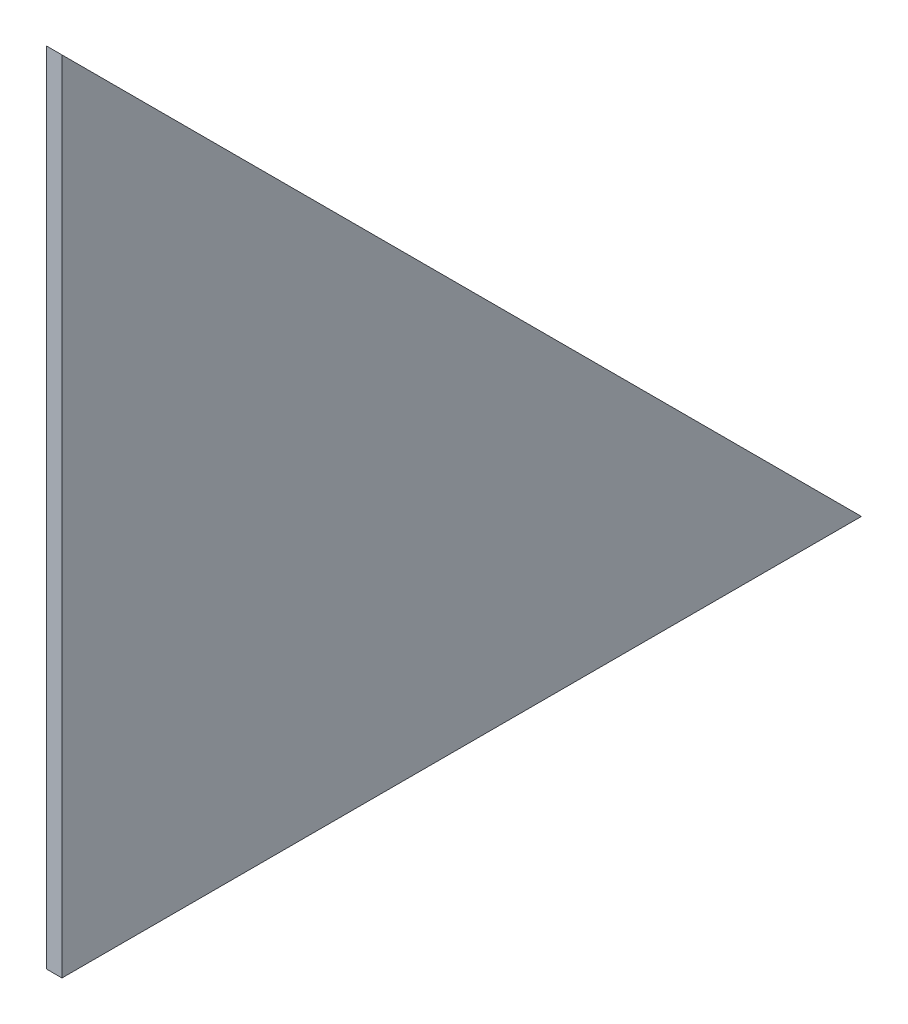
ISO-10303-21;
HEADER;
FILE_DESCRIPTION(('STEP AP214'),'2;1');
FILE_NAME('part.step','',(''),(''),'','','');
FILE_SCHEMA(('AUTOMOTIVE_DESIGN { 1 0 10303 214 1 1 1 1 }'));
ENDSEC;
DATA;
#1=APPLICATION_CONTEXT('core data for automotive mechanical design processes');
#2=APPLICATION_PROTOCOL_DEFINITION('international standard','automotive_design',2000,#1);
#3=PRODUCT_CONTEXT('',#1,'mechanical');
#4=PRODUCT('Part','Part','',(#3));
#5=PRODUCT_RELATED_PRODUCT_CATEGORY('part','',(#4));
#6=PRODUCT_DEFINITION_FORMATION('','',#4);
#7=PRODUCT_DEFINITION_CONTEXT('part definition',#1,'design');
#8=PRODUCT_DEFINITION('design','',#6,#7);
#9=PRODUCT_DEFINITION_SHAPE('','',#8);
#10=(LENGTH_UNIT() NAMED_UNIT(*) SI_UNIT(.MILLI.,.METRE.));
#11=(NAMED_UNIT(*) PLANE_ANGLE_UNIT() SI_UNIT($,.RADIAN.));
#12=(NAMED_UNIT(*) SI_UNIT($,.STERADIAN.) SOLID_ANGLE_UNIT());
#13=UNCERTAINTY_MEASURE_WITH_UNIT(LENGTH_MEASURE(1.E-05),#10,'distance_accuracy_value','');
#14=(GEOMETRIC_REPRESENTATION_CONTEXT(3) GLOBAL_UNCERTAINTY_ASSIGNED_CONTEXT((#13)) GLOBAL_UNIT_ASSIGNED_CONTEXT((#10,
#11,#12)) REPRESENTATION_CONTEXT('',''));
#15=CARTESIAN_POINT('',(0.,0.,0.));
#16=DIRECTION('',(0.,0.,1.));
#17=DIRECTION('',(1.,0.,0.));
#18=AXIS2_PLACEMENT_3D('',#15,#16,#17);
#19=CARTESIAN_POINT('',(3.175,0.,-165.099999999999));
#20=DIRECTION('',(0.,1.,0.));
#21=DIRECTION('',(0.,0.,1.));
#22=AXIS2_PLACEMENT_3D('',#19,#20,#21);
#23=PLANE('',#22);
#24=DIRECTION('',(0.,0.,-1.));
#25=VECTOR('',#24,1.);
#26=CARTESIAN_POINT('',(0.,0.,-165.099999999999));
#27=LINE('',#26,#25);
#28=CARTESIAN_POINT('',(0.,0.,0.));
#29=VERTEX_POINT('',#28);
#30=CARTESIAN_POINT('',(0.,0.,-165.099999999999));
#31=VERTEX_POINT('',#30);
#32=EDGE_CURVE('E89',#29,#31,#27,.T.);
#33=ORIENTED_EDGE('',*,*,#32,.T.);
#34=DIRECTION('',(-1.,0.,0.));
#35=VECTOR('',#34,1.);
#36=CARTESIAN_POINT('',(3.175,0.,-165.099999999999));
#37=LINE('',#36,#35);
#38=CARTESIAN_POINT('',(3.175,0.,-165.099999999999));
#39=VERTEX_POINT('',#38);
#40=EDGE_CURVE('E11',#39,#31,#37,.T.);
#41=ORIENTED_EDGE('',*,*,#40,.F.);
#42=DIRECTION('',(0.,0.,-1.));
#43=VECTOR('',#42,1.);
#44=CARTESIAN_POINT('',(3.175,0.,-165.099999999999));
#45=LINE('',#44,#43);
#46=CARTESIAN_POINT('',(3.175,0.,0.));
#47=VERTEX_POINT('',#46);
#48=EDGE_CURVE('E81',#47,#39,#45,.T.);
#49=ORIENTED_EDGE('',*,*,#48,.F.);
#50=DIRECTION('',(-1.,0.,0.));
#51=VECTOR('',#50,1.);
#52=CARTESIAN_POINT('',(3.175,0.,0.));
#53=LINE('',#52,#51);
#54=EDGE_CURVE('E90',#47,#29,#53,.T.);
#55=ORIENTED_EDGE('',*,*,#54,.T.);
#56=EDGE_LOOP('',(#33,#41,#49,#55));
#57=FACE_BOUND('',#56,.T.);
#58=ADVANCED_FACE('F39',(#57),#23,.F.);
#59=CARTESIAN_POINT('',(3.175,165.100000000001,0.));
#60=DIRECTION('',(0.,-0.707106781186544,0.707106781186551));
#61=DIRECTION('',(0.,-0.707106781186551,-0.707106781186544));
#62=AXIS2_PLACEMENT_3D('',#59,#60,#61);
#63=PLANE('',#62);
#64=DIRECTION('',(0.,0.707106781186551,0.707106781186544));
#65=VECTOR('',#64,1.);
#66=CARTESIAN_POINT('',(0.,165.100000000001,0.));
#67=LINE('',#66,#65);
#68=CARTESIAN_POINT('',(0.,165.100000000001,0.));
#69=VERTEX_POINT('',#68);
#70=EDGE_CURVE('E68',#31,#69,#67,.T.);
#71=ORIENTED_EDGE('',*,*,#70,.T.);
#72=DIRECTION('',(-1.,0.,0.));
#73=VECTOR('',#72,1.);
#74=CARTESIAN_POINT('',(3.175,165.100000000001,0.));
#75=LINE('',#74,#73);
#76=CARTESIAN_POINT('',(3.175,165.100000000001,0.));
#77=VERTEX_POINT('',#76);
#78=EDGE_CURVE('E48',#77,#69,#75,.T.);
#79=ORIENTED_EDGE('',*,*,#78,.F.);
#80=DIRECTION('',(0.,0.707106781186551,0.707106781186544));
#81=VECTOR('',#80,1.);
#82=CARTESIAN_POINT('',(3.175,165.100000000001,0.));
#83=LINE('',#82,#81);
#84=EDGE_CURVE('E76',#39,#77,#83,.T.);
#85=ORIENTED_EDGE('',*,*,#84,.F.);
#86=ORIENTED_EDGE('',*,*,#40,.T.);
#87=EDGE_LOOP('',(#71,#79,#85,#86));
#88=FACE_BOUND('',#87,.T.);
#89=ADVANCED_FACE('F77',(#88),#63,.F.);
#90=CARTESIAN_POINT('',(3.175,0.,0.));
#91=DIRECTION('',(0.,0.,-1.));
#92=DIRECTION('',(-1.,0.,0.));
#93=AXIS2_PLACEMENT_3D('',#90,#91,#92);
#94=PLANE('',#93);
#95=DIRECTION('',(0.,-1.,0.));
#96=VECTOR('',#95,1.);
#97=CARTESIAN_POINT('',(0.,0.,0.));
#98=LINE('',#97,#96);
#99=EDGE_CURVE('E73',#69,#29,#98,.T.);
#100=ORIENTED_EDGE('',*,*,#99,.T.);
#101=ORIENTED_EDGE('',*,*,#54,.F.);
#102=DIRECTION('',(0.,-1.,0.));
#103=VECTOR('',#102,1.);
#104=CARTESIAN_POINT('',(3.175,0.,0.));
#105=LINE('',#104,#103);
#106=EDGE_CURVE('E56',#77,#47,#105,.T.);
#107=ORIENTED_EDGE('',*,*,#106,.F.);
#108=ORIENTED_EDGE('',*,*,#78,.T.);
#109=EDGE_LOOP('',(#100,#101,#107,#108));
#110=FACE_BOUND('',#109,.T.);
#111=ADVANCED_FACE('F102',(#110),#94,.F.);
#112=CARTESIAN_POINT('',(3.175,0.,0.));
#113=DIRECTION('',(-1.,0.,0.));
#114=DIRECTION('',(0.,0.,1.));
#115=AXIS2_PLACEMENT_3D('',#112,#113,#114);
#116=PLANE('',#115);
#117=ORIENTED_EDGE('',*,*,#48,.T.);
#118=ORIENTED_EDGE('',*,*,#84,.T.);
#119=ORIENTED_EDGE('',*,*,#106,.T.);
#120=EDGE_LOOP('',(#117,#118,#119));
#121=FACE_BOUND('',#120,.T.);
#122=ADVANCED_FACE('F84',(#121),#116,.F.);
#123=CARTESIAN_POINT('',(0.,0.,0.));
#124=DIRECTION('',(-1.,0.,0.));
#125=DIRECTION('',(0.,0.,1.));
#126=AXIS2_PLACEMENT_3D('',#123,#124,#125);
#127=PLANE('',#126);
#128=ORIENTED_EDGE('',*,*,#32,.F.);
#129=ORIENTED_EDGE('',*,*,#99,.F.);
#130=ORIENTED_EDGE('',*,*,#70,.F.);
#131=EDGE_LOOP('',(#128,#129,#130));
#132=FACE_BOUND('',#131,.T.);
#133=ADVANCED_FACE('F103',(#132),#127,.T.);
#134=CLOSED_SHELL('',(#58,#89,#111,#122,#133));
#135=MANIFOLD_SOLID_BREP('B2',#134);
#136=ADVANCED_BREP_SHAPE_REPRESENTATION('',(#18,#135),#14);
#137=SHAPE_DEFINITION_REPRESENTATION(#9,#136);
ENDSEC;
END-ISO-10303-21;
